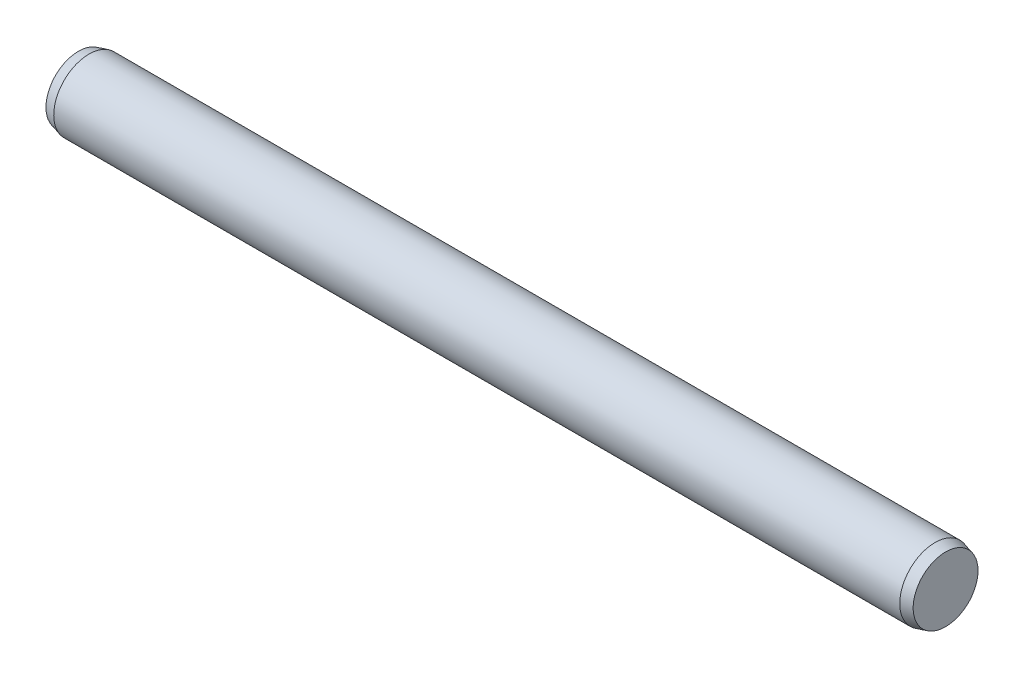
ISO-10303-21;
HEADER;
FILE_DESCRIPTION(('STEP AP214'),'2;1');
FILE_NAME('part.step','',(''),(''),'','','');
FILE_SCHEMA(('AUTOMOTIVE_DESIGN { 1 0 10303 214 1 1 1 1 }'));
ENDSEC;
DATA;
#1=APPLICATION_CONTEXT('core data for automotive mechanical design processes');
#2=APPLICATION_PROTOCOL_DEFINITION('international standard','automotive_design',2000,#1);
#3=PRODUCT_CONTEXT('',#1,'mechanical');
#4=PRODUCT('Part','Part','',(#3));
#5=PRODUCT_RELATED_PRODUCT_CATEGORY('part','',(#4));
#6=PRODUCT_DEFINITION_FORMATION('','',#4);
#7=PRODUCT_DEFINITION_CONTEXT('part definition',#1,'design');
#8=PRODUCT_DEFINITION('design','',#6,#7);
#9=PRODUCT_DEFINITION_SHAPE('','',#8);
#10=(LENGTH_UNIT() NAMED_UNIT(*) SI_UNIT(.MILLI.,.METRE.));
#11=(NAMED_UNIT(*) PLANE_ANGLE_UNIT() SI_UNIT($,.RADIAN.));
#12=(NAMED_UNIT(*) SI_UNIT($,.STERADIAN.) SOLID_ANGLE_UNIT());
#13=UNCERTAINTY_MEASURE_WITH_UNIT(LENGTH_MEASURE(1.E-05),#10,'distance_accuracy_value','');
#14=(GEOMETRIC_REPRESENTATION_CONTEXT(3) GLOBAL_UNCERTAINTY_ASSIGNED_CONTEXT((#13)) GLOBAL_UNIT_ASSIGNED_CONTEXT((#10,
#11,#12)) REPRESENTATION_CONTEXT('',''));
#15=CARTESIAN_POINT('',(0.,0.,0.));
#16=DIRECTION('',(0.,0.,1.));
#17=DIRECTION('',(1.,0.,0.));
#18=AXIS2_PLACEMENT_3D('',#15,#16,#17);
#19=CARTESIAN_POINT('',(-12.,0.,0.));
#20=DIRECTION('',(1.,0.,0.));
#21=DIRECTION('',(0.,0.,-1.));
#22=AXIS2_PLACEMENT_3D('',#19,#20,#21);
#23=CYLINDRICAL_SURFACE('',#22,1.);
#24=CARTESIAN_POINT('',(-12.,0.,0.));
#25=DIRECTION('',(-1.,0.,0.));
#26=DIRECTION('',(0.,0.,1.));
#27=AXIS2_PLACEMENT_3D('',#24,#25,#26);
#28=CIRCLE('',#27,1.);
#29=CARTESIAN_POINT('',(-12.,0.,1.));
#30=VERTEX_POINT('',#29);
#31=EDGE_CURVE('E44',#30,#30,#28,.T.);
#32=ORIENTED_EDGE('',*,*,#31,.F.);
#33=EDGE_LOOP('',(#32));
#34=FACE_BOUND('',#33,.T.);
#35=CARTESIAN_POINT('',(12.,0.,0.));
#36=DIRECTION('',(1.,0.,0.));
#37=DIRECTION('',(0.,0.,-1.));
#38=AXIS2_PLACEMENT_3D('',#35,#36,#37);
#39=CIRCLE('',#38,1.);
#40=CARTESIAN_POINT('',(12.,0.,-1.));
#41=VERTEX_POINT('',#40);
#42=EDGE_CURVE('E10',#41,#41,#39,.T.);
#43=ORIENTED_EDGE('',*,*,#42,.F.);
#44=EDGE_LOOP('',(#43));
#45=FACE_BOUND('',#44,.T.);
#46=ADVANCED_FACE('F30',(#34,#45),#23,.T.);
#47=CARTESIAN_POINT('',(12.,0.,0.));
#48=DIRECTION('',(-1.,0.,0.));
#49=DIRECTION('',(0.,0.,-1.));
#50=AXIS2_PLACEMENT_3D('',#47,#48,#49);
#51=CONICAL_SURFACE('',#50,1.,0.26179938779915);
#52=CARTESIAN_POINT('',(12.3,0.,0.));
#53=DIRECTION('',(1.,0.,0.));
#54=DIRECTION('',(0.,0.,-1.));
#55=AXIS2_PLACEMENT_3D('',#52,#53,#54);
#56=CIRCLE('',#55,0.919615242270664);
#57=CARTESIAN_POINT('',(12.3,0.,-0.919615242270664));
#58=VERTEX_POINT('',#57);
#59=EDGE_CURVE('E36',#58,#58,#56,.T.);
#60=ORIENTED_EDGE('',*,*,#59,.F.);
#61=EDGE_LOOP('',(#60));
#62=FACE_BOUND('',#61,.T.);
#63=ORIENTED_EDGE('',*,*,#42,.T.);
#64=EDGE_LOOP('',(#63));
#65=FACE_BOUND('',#64,.T.);
#66=ADVANCED_FACE('F54',(#62,#65),#51,.T.);
#67=CARTESIAN_POINT('',(12.3,0.,0.));
#68=DIRECTION('',(1.,0.,0.));
#69=DIRECTION('',(0.,0.,-1.));
#70=AXIS2_PLACEMENT_3D('',#67,#68,#69);
#71=PLANE('',#70);
#72=ORIENTED_EDGE('',*,*,#59,.T.);
#73=EDGE_LOOP('',(#72));
#74=FACE_BOUND('',#73,.T.);
#75=ADVANCED_FACE('F58',(#74),#71,.T.);
#76=CARTESIAN_POINT('',(-12.,0.,0.));
#77=DIRECTION('',(1.,0.,0.));
#78=DIRECTION('',(0.,0.,1.));
#79=AXIS2_PLACEMENT_3D('',#76,#77,#78);
#80=CONICAL_SURFACE('',#79,1.,0.26179938779915);
#81=CARTESIAN_POINT('',(-12.3,0.,0.));
#82=DIRECTION('',(-1.,0.,0.));
#83=DIRECTION('',(0.,0.,1.));
#84=AXIS2_PLACEMENT_3D('',#81,#82,#83);
#85=CIRCLE('',#84,0.919615242270665);
#86=CARTESIAN_POINT('',(-12.3,0.,0.919615242270665));
#87=VERTEX_POINT('',#86);
#88=EDGE_CURVE('E40',#87,#87,#85,.T.);
#89=ORIENTED_EDGE('',*,*,#88,.F.);
#90=EDGE_LOOP('',(#89));
#91=FACE_BOUND('',#90,.T.);
#92=ORIENTED_EDGE('',*,*,#31,.T.);
#93=EDGE_LOOP('',(#92));
#94=FACE_BOUND('',#93,.T.);
#95=ADVANCED_FACE('F50',(#91,#94),#80,.T.);
#96=CARTESIAN_POINT('',(-12.3,0.,0.));
#97=DIRECTION('',(-1.,0.,0.));
#98=DIRECTION('',(0.,0.,1.));
#99=AXIS2_PLACEMENT_3D('',#96,#97,#98);
#100=PLANE('',#99);
#101=ORIENTED_EDGE('',*,*,#88,.T.);
#102=EDGE_LOOP('',(#101));
#103=FACE_BOUND('',#102,.T.);
#104=ADVANCED_FACE('F67',(#103),#100,.T.);
#105=CLOSED_SHELL('',(#46,#66,#75,#95,#104));
#106=MANIFOLD_SOLID_BREP('B2',#105);
#107=ADVANCED_BREP_SHAPE_REPRESENTATION('',(#18,#106),#14);
#108=SHAPE_DEFINITION_REPRESENTATION(#9,#107);
ENDSEC;
END-ISO-10303-21;
